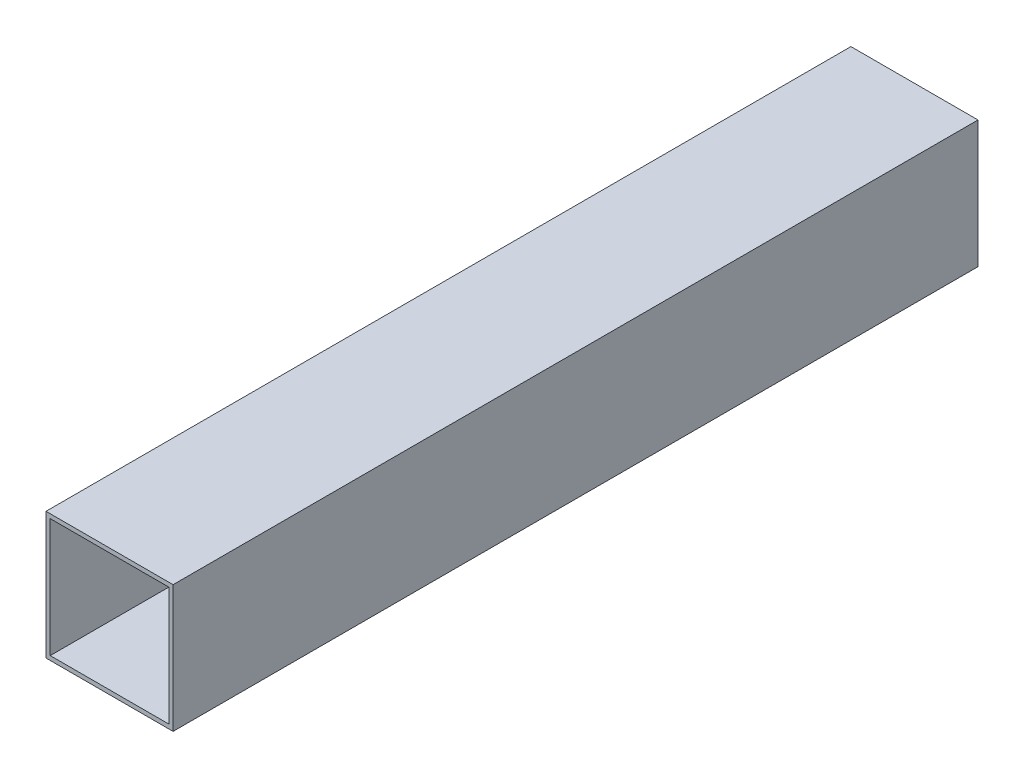
ISO-10303-21;
HEADER;
FILE_DESCRIPTION(('STEP AP214'),'2;1');
FILE_NAME('part.step','',(''),(''),'','','');
FILE_SCHEMA(('AUTOMOTIVE_DESIGN { 1 0 10303 214 1 1 1 1 }'));
ENDSEC;
DATA;
#1=APPLICATION_CONTEXT('core data for automotive mechanical design processes');
#2=APPLICATION_PROTOCOL_DEFINITION('international standard','automotive_design',2000,#1);
#3=PRODUCT_CONTEXT('',#1,'mechanical');
#4=PRODUCT('Part','Part','',(#3));
#5=PRODUCT_RELATED_PRODUCT_CATEGORY('part','',(#4));
#6=PRODUCT_DEFINITION_FORMATION('','',#4);
#7=PRODUCT_DEFINITION_CONTEXT('part definition',#1,'design');
#8=PRODUCT_DEFINITION('design','',#6,#7);
#9=PRODUCT_DEFINITION_SHAPE('','',#8);
#10=(LENGTH_UNIT() NAMED_UNIT(*) SI_UNIT(.MILLI.,.METRE.));
#11=(NAMED_UNIT(*) PLANE_ANGLE_UNIT() SI_UNIT($,.RADIAN.));
#12=(NAMED_UNIT(*) SI_UNIT($,.STERADIAN.) SOLID_ANGLE_UNIT());
#13=UNCERTAINTY_MEASURE_WITH_UNIT(LENGTH_MEASURE(1.E-05),#10,'distance_accuracy_value','');
#14=(GEOMETRIC_REPRESENTATION_CONTEXT(3) GLOBAL_UNCERTAINTY_ASSIGNED_CONTEXT((#13)) GLOBAL_UNIT_ASSIGNED_CONTEXT((#10,
#11,#12)) REPRESENTATION_CONTEXT('',''));
#15=CARTESIAN_POINT('',(0.,0.,0.));
#16=DIRECTION('',(0.,0.,1.));
#17=DIRECTION('',(1.,0.,0.));
#18=AXIS2_PLACEMENT_3D('',#15,#16,#17);
#19=CARTESIAN_POINT('',(27.0000000000002,442.,60.));
#20=DIRECTION('',(-1.,0.,0.));
#21=DIRECTION('',(0.,0.,1.));
#22=AXIS2_PLACEMENT_3D('',#19,#20,#21);
#23=PLANE('',#22);
#24=DIRECTION('',(0.,1.,0.));
#25=VECTOR('',#24,1.);
#26=CARTESIAN_POINT('',(27.0000000000002,442.,440.));
#27=LINE('',#26,#25);
#28=CARTESIAN_POINT('',(27.0000000000002,442.,440.));
#29=VERTEX_POINT('',#28);
#30=CARTESIAN_POINT('',(27.0000000000002,498.,440.));
#31=VERTEX_POINT('',#30);
#32=EDGE_CURVE('E156',#29,#31,#27,.T.);
#33=ORIENTED_EDGE('',*,*,#32,.T.);
#34=DIRECTION('',(0.,0.,1.));
#35=VECTOR('',#34,1.);
#36=CARTESIAN_POINT('',(27.0000000000002,498.,60.));
#37=LINE('',#36,#35);
#38=CARTESIAN_POINT('',(27.0000000000002,498.,60.));
#39=VERTEX_POINT('',#38);
#40=EDGE_CURVE('E166',#39,#31,#37,.T.);
#41=ORIENTED_EDGE('',*,*,#40,.F.);
#42=DIRECTION('',(0.,1.,0.));
#43=VECTOR('',#42,1.);
#44=CARTESIAN_POINT('',(27.0000000000002,442.,60.));
#45=LINE('',#44,#43);
#46=CARTESIAN_POINT('',(27.0000000000002,442.,60.));
#47=VERTEX_POINT('',#46);
#48=EDGE_CURVE('E123',#47,#39,#45,.T.);
#49=ORIENTED_EDGE('',*,*,#48,.F.);
#50=DIRECTION('',(0.,0.,1.));
#51=VECTOR('',#50,1.);
#52=CARTESIAN_POINT('',(27.0000000000002,442.,60.));
#53=LINE('',#52,#51);
#54=EDGE_CURVE('E12',#47,#29,#53,.T.);
#55=ORIENTED_EDGE('',*,*,#54,.T.);
#56=EDGE_LOOP('',(#33,#41,#49,#55));
#57=FACE_BOUND('',#56,.T.);
#58=ADVANCED_FACE('F19',(#57),#23,.T.);
#59=CARTESIAN_POINT('',(-28.9999999999998,442.,60.));
#60=DIRECTION('',(0.,1.,0.));
#61=DIRECTION('',(0.,0.,-1.));
#62=AXIS2_PLACEMENT_3D('',#59,#60,#61);
#63=PLANE('',#62);
#64=DIRECTION('',(1.,0.,0.));
#65=VECTOR('',#64,1.);
#66=CARTESIAN_POINT('',(-28.9999999999998,442.,440.));
#67=LINE('',#66,#65);
#68=CARTESIAN_POINT('',(-28.9999999999998,442.,440.));
#69=VERTEX_POINT('',#68);
#70=EDGE_CURVE('E309',#69,#29,#67,.T.);
#71=ORIENTED_EDGE('',*,*,#70,.T.);
#72=ORIENTED_EDGE('',*,*,#54,.F.);
#73=DIRECTION('',(1.,0.,0.));
#74=VECTOR('',#73,1.);
#75=CARTESIAN_POINT('',(-28.9999999999998,442.,60.));
#76=LINE('',#75,#74);
#77=CARTESIAN_POINT('',(-28.9999999999998,442.,60.));
#78=VERTEX_POINT('',#77);
#79=EDGE_CURVE('E107',#78,#47,#76,.T.);
#80=ORIENTED_EDGE('',*,*,#79,.F.);
#81=DIRECTION('',(0.,0.,1.));
#82=VECTOR('',#81,1.);
#83=CARTESIAN_POINT('',(-28.9999999999998,442.,60.));
#84=LINE('',#83,#82);
#85=EDGE_CURVE('E31',#78,#69,#84,.T.);
#86=ORIENTED_EDGE('',*,*,#85,.T.);
#87=EDGE_LOOP('',(#71,#72,#80,#86));
#88=FACE_BOUND('',#87,.T.);
#89=ADVANCED_FACE('F120',(#88),#63,.T.);
#90=CARTESIAN_POINT('',(-28.9999999999998,442.,60.));
#91=DIRECTION('',(1.,0.,0.));
#92=DIRECTION('',(0.,0.,-1.));
#93=AXIS2_PLACEMENT_3D('',#90,#91,#92);
#94=PLANE('',#93);
#95=DIRECTION('',(0.,-1.,0.));
#96=VECTOR('',#95,1.);
#97=CARTESIAN_POINT('',(-28.9999999999998,442.,440.));
#98=LINE('',#97,#96);
#99=CARTESIAN_POINT('',(-28.9999999999998,498.,440.));
#100=VERTEX_POINT('',#99);
#101=EDGE_CURVE('E114',#100,#69,#98,.T.);
#102=ORIENTED_EDGE('',*,*,#101,.T.);
#103=ORIENTED_EDGE('',*,*,#85,.F.);
#104=DIRECTION('',(0.,-1.,0.));
#105=VECTOR('',#104,1.);
#106=CARTESIAN_POINT('',(-28.9999999999998,442.,60.));
#107=LINE('',#106,#105);
#108=CARTESIAN_POINT('',(-28.9999999999998,498.,60.));
#109=VERTEX_POINT('',#108);
#110=EDGE_CURVE('E103',#109,#78,#107,.T.);
#111=ORIENTED_EDGE('',*,*,#110,.F.);
#112=DIRECTION('',(0.,0.,1.));
#113=VECTOR('',#112,1.);
#114=CARTESIAN_POINT('',(-28.9999999999998,498.,60.));
#115=LINE('',#114,#113);
#116=EDGE_CURVE('E118',#109,#100,#115,.T.);
#117=ORIENTED_EDGE('',*,*,#116,.T.);
#118=EDGE_LOOP('',(#102,#103,#111,#117));
#119=FACE_BOUND('',#118,.T.);
#120=ADVANCED_FACE('F113',(#119),#94,.T.);
#121=CARTESIAN_POINT('',(29.0000000000002,440.,60.));
#122=DIRECTION('',(-1.,0.,0.));
#123=DIRECTION('',(0.,0.,1.));
#124=AXIS2_PLACEMENT_3D('',#121,#122,#123);
#125=PLANE('',#124);
#126=DIRECTION('',(0.,1.,0.));
#127=VECTOR('',#126,1.);
#128=CARTESIAN_POINT('',(29.0000000000002,440.,440.));
#129=LINE('',#128,#127);
#130=CARTESIAN_POINT('',(29.0000000000002,440.,440.));
#131=VERTEX_POINT('',#130);
#132=CARTESIAN_POINT('',(29.0000000000002,500.,440.));
#133=VERTEX_POINT('',#132);
#134=EDGE_CURVE('E134',#131,#133,#129,.T.);
#135=ORIENTED_EDGE('',*,*,#134,.F.);
#136=DIRECTION('',(0.,0.,1.));
#137=VECTOR('',#136,1.);
#138=CARTESIAN_POINT('',(29.0000000000002,440.,60.));
#139=LINE('',#138,#137);
#140=CARTESIAN_POINT('',(29.0000000000002,440.,60.));
#141=VERTEX_POINT('',#140);
#142=EDGE_CURVE('E133',#141,#131,#139,.T.);
#143=ORIENTED_EDGE('',*,*,#142,.F.);
#144=DIRECTION('',(0.,1.,0.));
#145=VECTOR('',#144,1.);
#146=CARTESIAN_POINT('',(29.0000000000002,440.,60.));
#147=LINE('',#146,#145);
#148=CARTESIAN_POINT('',(29.0000000000002,500.,60.));
#149=VERTEX_POINT('',#148);
#150=EDGE_CURVE('E164',#141,#149,#147,.T.);
#151=ORIENTED_EDGE('',*,*,#150,.T.);
#152=DIRECTION('',(0.,0.,1.));
#153=VECTOR('',#152,1.);
#154=CARTESIAN_POINT('',(29.0000000000002,500.,60.));
#155=LINE('',#154,#153);
#156=EDGE_CURVE('E24',#149,#133,#155,.T.);
#157=ORIENTED_EDGE('',*,*,#156,.T.);
#158=EDGE_LOOP('',(#135,#143,#151,#157));
#159=FACE_BOUND('',#158,.T.);
#160=ADVANCED_FACE('F22',(#159),#125,.F.);
#161=CARTESIAN_POINT('',(-30.9999999999998,500.,60.));
#162=DIRECTION('',(0.,-1.,0.));
#163=DIRECTION('',(0.,0.,1.));
#164=AXIS2_PLACEMENT_3D('',#161,#162,#163);
#165=PLANE('',#164);
#166=DIRECTION('',(-1.,0.,0.));
#167=VECTOR('',#166,1.);
#168=CARTESIAN_POINT('',(-30.9999999999998,500.,440.));
#169=LINE('',#168,#167);
#170=CARTESIAN_POINT('',(-30.9999999999998,500.,440.));
#171=VERTEX_POINT('',#170);
#172=EDGE_CURVE('E139',#133,#171,#169,.T.);
#173=ORIENTED_EDGE('',*,*,#172,.F.);
#174=ORIENTED_EDGE('',*,*,#156,.F.);
#175=DIRECTION('',(-1.,0.,0.));
#176=VECTOR('',#175,1.);
#177=CARTESIAN_POINT('',(-30.9999999999998,500.,60.));
#178=LINE('',#177,#176);
#179=CARTESIAN_POINT('',(-30.9999999999998,500.,60.));
#180=VERTEX_POINT('',#179);
#181=EDGE_CURVE('E88',#149,#180,#178,.T.);
#182=ORIENTED_EDGE('',*,*,#181,.T.);
#183=DIRECTION('',(0.,0.,1.));
#184=VECTOR('',#183,1.);
#185=CARTESIAN_POINT('',(-30.9999999999998,500.,60.));
#186=LINE('',#185,#184);
#187=EDGE_CURVE('E177',#180,#171,#186,.T.);
#188=ORIENTED_EDGE('',*,*,#187,.T.);
#189=EDGE_LOOP('',(#173,#174,#182,#188));
#190=FACE_BOUND('',#189,.T.);
#191=ADVANCED_FACE('F207',(#190),#165,.F.);
#192=CARTESIAN_POINT('',(-30.9999999999998,440.,60.));
#193=DIRECTION('',(1.,0.,0.));
#194=DIRECTION('',(0.,0.,-1.));
#195=AXIS2_PLACEMENT_3D('',#192,#193,#194);
#196=PLANE('',#195);
#197=DIRECTION('',(0.,-1.,0.));
#198=VECTOR('',#197,1.);
#199=CARTESIAN_POINT('',(-30.9999999999998,440.,440.));
#200=LINE('',#199,#198);
#201=CARTESIAN_POINT('',(-30.9999999999998,440.,440.));
#202=VERTEX_POINT('',#201);
#203=EDGE_CURVE('E148',#171,#202,#200,.T.);
#204=ORIENTED_EDGE('',*,*,#203,.F.);
#205=ORIENTED_EDGE('',*,*,#187,.F.);
#206=DIRECTION('',(0.,-1.,0.));
#207=VECTOR('',#206,1.);
#208=CARTESIAN_POINT('',(-30.9999999999998,440.,60.));
#209=LINE('',#208,#207);
#210=CARTESIAN_POINT('',(-30.9999999999998,440.,60.));
#211=VERTEX_POINT('',#210);
#212=EDGE_CURVE('E198',#180,#211,#209,.T.);
#213=ORIENTED_EDGE('',*,*,#212,.T.);
#214=DIRECTION('',(0.,0.,1.));
#215=VECTOR('',#214,1.);
#216=CARTESIAN_POINT('',(-30.9999999999998,440.,60.));
#217=LINE('',#216,#215);
#218=EDGE_CURVE('E174',#211,#202,#217,.T.);
#219=ORIENTED_EDGE('',*,*,#218,.T.);
#220=EDGE_LOOP('',(#204,#205,#213,#219));
#221=FACE_BOUND('',#220,.T.);
#222=ADVANCED_FACE('F206',(#221),#196,.F.);
#223=CARTESIAN_POINT('',(-30.9999999999998,440.,60.));
#224=DIRECTION('',(0.,1.,0.));
#225=DIRECTION('',(0.,0.,-1.));
#226=AXIS2_PLACEMENT_3D('',#223,#224,#225);
#227=PLANE('',#226);
#228=DIRECTION('',(1.,0.,0.));
#229=VECTOR('',#228,1.);
#230=CARTESIAN_POINT('',(-30.9999999999998,440.,440.));
#231=LINE('',#230,#229);
#232=EDGE_CURVE('E153',#202,#131,#231,.T.);
#233=ORIENTED_EDGE('',*,*,#232,.F.);
#234=ORIENTED_EDGE('',*,*,#218,.F.);
#235=DIRECTION('',(1.,0.,0.));
#236=VECTOR('',#235,1.);
#237=CARTESIAN_POINT('',(-30.9999999999998,440.,60.));
#238=LINE('',#237,#236);
#239=EDGE_CURVE('E127',#211,#141,#238,.T.);
#240=ORIENTED_EDGE('',*,*,#239,.T.);
#241=ORIENTED_EDGE('',*,*,#142,.T.);
#242=EDGE_LOOP('',(#233,#234,#240,#241));
#243=FACE_BOUND('',#242,.T.);
#244=ADVANCED_FACE('F195',(#243),#227,.F.);
#245=CARTESIAN_POINT('',(-28.9999999999998,498.,60.));
#246=DIRECTION('',(0.,-1.,0.));
#247=DIRECTION('',(0.,0.,1.));
#248=AXIS2_PLACEMENT_3D('',#245,#246,#247);
#249=PLANE('',#248);
#250=DIRECTION('',(-1.,0.,0.));
#251=VECTOR('',#250,1.);
#252=CARTESIAN_POINT('',(-28.9999999999998,498.,440.));
#253=LINE('',#252,#251);
#254=EDGE_CURVE('E74',#31,#100,#253,.T.);
#255=ORIENTED_EDGE('',*,*,#254,.T.);
#256=ORIENTED_EDGE('',*,*,#116,.F.);
#257=DIRECTION('',(-1.,0.,0.));
#258=VECTOR('',#257,1.);
#259=CARTESIAN_POINT('',(-28.9999999999998,498.,60.));
#260=LINE('',#259,#258);
#261=EDGE_CURVE('E40',#39,#109,#260,.T.);
#262=ORIENTED_EDGE('',*,*,#261,.F.);
#263=ORIENTED_EDGE('',*,*,#40,.T.);
#264=EDGE_LOOP('',(#255,#256,#262,#263));
#265=FACE_BOUND('',#264,.T.);
#266=ADVANCED_FACE('F233',(#265),#249,.T.);
#267=CARTESIAN_POINT('',(0.,-29.9999999999998,60.));
#268=DIRECTION('',(0.,0.,1.));
#269=DIRECTION('',(1.,0.,0.));
#270=AXIS2_PLACEMENT_3D('',#267,#268,#269);
#271=PLANE('',#270);
#272=ORIENTED_EDGE('',*,*,#150,.F.);
#273=ORIENTED_EDGE('',*,*,#239,.F.);
#274=ORIENTED_EDGE('',*,*,#212,.F.);
#275=ORIENTED_EDGE('',*,*,#181,.F.);
#276=EDGE_LOOP('',(#272,#273,#274,#275));
#277=FACE_BOUND('',#276,.T.);
#278=ORIENTED_EDGE('',*,*,#48,.T.);
#279=ORIENTED_EDGE('',*,*,#261,.T.);
#280=ORIENTED_EDGE('',*,*,#110,.T.);
#281=ORIENTED_EDGE('',*,*,#79,.T.);
#282=EDGE_LOOP('',(#278,#279,#280,#281));
#283=FACE_BOUND('',#282,.T.);
#284=ADVANCED_FACE('F105',(#277,#283),#271,.F.);
#285=CARTESIAN_POINT('',(0.,-30.,440.));
#286=DIRECTION('',(0.,0.,1.));
#287=DIRECTION('',(1.,0.,0.));
#288=AXIS2_PLACEMENT_3D('',#285,#286,#287);
#289=PLANE('',#288);
#290=ORIENTED_EDGE('',*,*,#134,.T.);
#291=ORIENTED_EDGE('',*,*,#172,.T.);
#292=ORIENTED_EDGE('',*,*,#203,.T.);
#293=ORIENTED_EDGE('',*,*,#232,.T.);
#294=EDGE_LOOP('',(#290,#291,#292,#293));
#295=FACE_BOUND('',#294,.T.);
#296=ORIENTED_EDGE('',*,*,#32,.F.);
#297=ORIENTED_EDGE('',*,*,#70,.F.);
#298=ORIENTED_EDGE('',*,*,#101,.F.);
#299=ORIENTED_EDGE('',*,*,#254,.F.);
#300=EDGE_LOOP('',(#296,#297,#298,#299));
#301=FACE_BOUND('',#300,.T.);
#302=ADVANCED_FACE('F192',(#295,#301),#289,.T.);
#303=CLOSED_SHELL('',(#58,#89,#120,#160,#191,#222,#244,#266,#284,#302));
#304=MANIFOLD_SOLID_BREP('B1',#303);
#305=ADVANCED_BREP_SHAPE_REPRESENTATION('',(#18,#304),#14);
#306=SHAPE_DEFINITION_REPRESENTATION(#9,#305);
ENDSEC;
END-ISO-10303-21;
